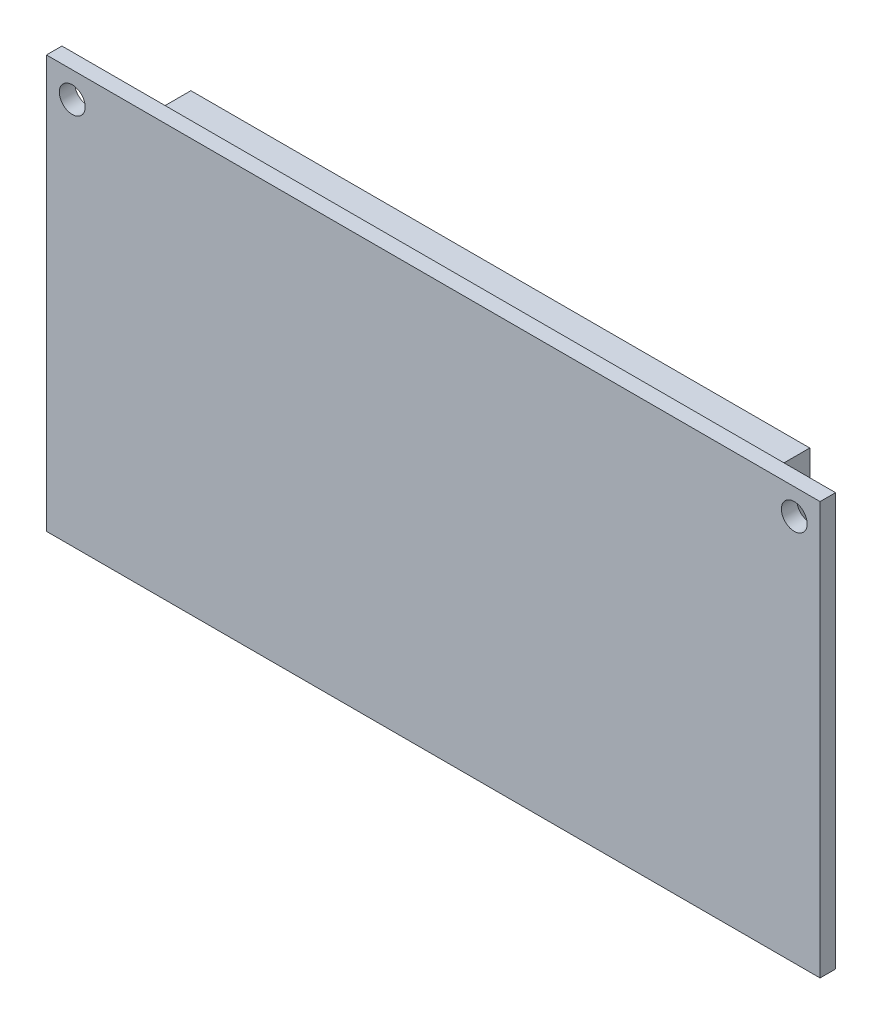
ISO-10303-21;
HEADER;
FILE_DESCRIPTION(('STEP AP214'),'2;1');
FILE_NAME('part.step','',(''),(''),'','','');
FILE_SCHEMA(('AUTOMOTIVE_DESIGN { 1 0 10303 214 1 1 1 1 }'));
ENDSEC;
DATA;
#1=APPLICATION_CONTEXT('core data for automotive mechanical design processes');
#2=APPLICATION_PROTOCOL_DEFINITION('international standard','automotive_design',2000,#1);
#3=PRODUCT_CONTEXT('',#1,'mechanical');
#4=PRODUCT('Part','Part','',(#3));
#5=PRODUCT_RELATED_PRODUCT_CATEGORY('part','',(#4));
#6=PRODUCT_DEFINITION_FORMATION('','',#4);
#7=PRODUCT_DEFINITION_CONTEXT('part definition',#1,'design');
#8=PRODUCT_DEFINITION('design','',#6,#7);
#9=PRODUCT_DEFINITION_SHAPE('','',#8);
#10=(LENGTH_UNIT() NAMED_UNIT(*) SI_UNIT(.MILLI.,.METRE.));
#11=(NAMED_UNIT(*) PLANE_ANGLE_UNIT() SI_UNIT($,.RADIAN.));
#12=(NAMED_UNIT(*) SI_UNIT($,.STERADIAN.) SOLID_ANGLE_UNIT());
#13=UNCERTAINTY_MEASURE_WITH_UNIT(LENGTH_MEASURE(1.E-05),#10,'distance_accuracy_value','');
#14=(GEOMETRIC_REPRESENTATION_CONTEXT(3) GLOBAL_UNCERTAINTY_ASSIGNED_CONTEXT((#13)) GLOBAL_UNIT_ASSIGNED_CONTEXT((#10,
#11,#12)) REPRESENTATION_CONTEXT('',''));
#15=CARTESIAN_POINT('',(0.,0.,0.));
#16=DIRECTION('',(0.,0.,1.));
#17=DIRECTION('',(1.,0.,0.));
#18=AXIS2_PLACEMENT_3D('',#15,#16,#17);
#19=CARTESIAN_POINT('',(0.,0.,0.));
#20=DIRECTION('',(0.,0.,1.));
#21=DIRECTION('',(1.,0.,0.));
#22=AXIS2_PLACEMENT_3D('',#19,#20,#21);
#23=PLANE('',#22);
#24=CARTESIAN_POINT('',(-8.61877519595136,65.2421631901448,0.));
#25=DIRECTION('',(0.,0.,-1.));
#26=DIRECTION('',(-1.,0.,0.));
#27=AXIS2_PLACEMENT_3D('',#24,#25,#26);
#28=CIRCLE('',#27,2.5);
#29=CARTESIAN_POINT('',(-11.1187751959514,65.2421631901448,0.));
#30=VERTEX_POINT('',#29);
#31=EDGE_CURVE('E341',#30,#30,#28,.T.);
#32=ORIENTED_EDGE('',*,*,#31,.F.);
#33=EDGE_LOOP('',(#32));
#34=FACE_BOUND('',#33,.T.);
#35=CARTESIAN_POINT('',(131.381224804049,65.2421631901448,0.));
#36=DIRECTION('',(0.,0.,-1.));
#37=DIRECTION('',(-1.,0.,0.));
#38=AXIS2_PLACEMENT_3D('',#35,#36,#37);
#39=CIRCLE('',#38,2.5);
#40=CARTESIAN_POINT('',(128.881224804049,65.2421631901448,0.));
#41=VERTEX_POINT('',#40);
#42=EDGE_CURVE('E190',#41,#41,#39,.T.);
#43=ORIENTED_EDGE('',*,*,#42,.F.);
#44=EDGE_LOOP('',(#43));
#45=FACE_BOUND('',#44,.T.);
#46=DIRECTION('',(-1.,0.,0.));
#47=VECTOR('',#46,1.);
#48=CARTESIAN_POINT('',(116.381224804049,-2.00783680985524,0.));
#49=LINE('',#48,#47);
#50=CARTESIAN_POINT('',(124.381224804049,-2.00783680985523,0.));
#51=VERTEX_POINT('',#50);
#52=CARTESIAN_POINT('',(116.381224804049,-2.00783680985524,0.));
#53=VERTEX_POINT('',#52);
#54=EDGE_CURVE('E69',#51,#53,#49,.T.);
#55=ORIENTED_EDGE('',*,*,#54,.F.);
#56=DIRECTION('',(0.,-1.,0.));
#57=VECTOR('',#56,1.);
#58=CARTESIAN_POINT('',(124.381224804049,19.2421631901448,0.));
#59=LINE('',#58,#57);
#60=CARTESIAN_POINT('',(124.381224804049,40.4921631901448,0.));
#61=VERTEX_POINT('',#60);
#62=EDGE_CURVE('E218',#61,#51,#59,.T.);
#63=ORIENTED_EDGE('',*,*,#62,.F.);
#64=DIRECTION('',(1.,0.,0.));
#65=VECTOR('',#64,1.);
#66=CARTESIAN_POINT('',(124.381224804049,40.4921631901448,0.));
#67=LINE('',#66,#65);
#68=CARTESIAN_POINT('',(116.381224804049,40.4921631901448,0.));
#69=VERTEX_POINT('',#68);
#70=EDGE_CURVE('E233',#69,#61,#67,.T.);
#71=ORIENTED_EDGE('',*,*,#70,.F.);
#72=DIRECTION('',(0.,-1.,0.));
#73=VECTOR('',#72,1.);
#74=CARTESIAN_POINT('',(116.381224804049,0.,0.));
#75=LINE('',#74,#73);
#76=CARTESIAN_POINT('',(116.381224804049,60.2421631901448,0.));
#77=VERTEX_POINT('',#76);
#78=EDGE_CURVE('E273',#77,#69,#75,.T.);
#79=ORIENTED_EDGE('',*,*,#78,.F.);
#80=DIRECTION('',(-1.,0.,0.));
#81=VECTOR('',#80,1.);
#82=CARTESIAN_POINT('',(0.,60.2421631901448,0.));
#83=LINE('',#82,#81);
#84=CARTESIAN_POINT('',(-3.61877519595136,60.2421631901448,0.));
#85=VERTEX_POINT('',#84);
#86=EDGE_CURVE('E253',#77,#85,#83,.T.);
#87=ORIENTED_EDGE('',*,*,#86,.T.);
#88=DIRECTION('',(0.,-1.,0.));
#89=VECTOR('',#88,1.);
#90=CARTESIAN_POINT('',(-3.61877519595136,0.,0.));
#91=LINE('',#90,#89);
#92=CARTESIAN_POINT('',(-3.61877519595136,-9.75783680985523,0.));
#93=VERTEX_POINT('',#92);
#94=EDGE_CURVE('E259',#85,#93,#91,.T.);
#95=ORIENTED_EDGE('',*,*,#94,.T.);
#96=DIRECTION('',(1.,0.,0.));
#97=VECTOR('',#96,1.);
#98=CARTESIAN_POINT('',(-13.6187751959514,-9.75783680985523,0.));
#99=LINE('',#98,#97);
#100=CARTESIAN_POINT('',(-13.6187751959514,-9.75783680985523,0.));
#101=VERTEX_POINT('',#100);
#102=EDGE_CURVE('E314',#101,#93,#99,.T.);
#103=ORIENTED_EDGE('',*,*,#102,.F.);
#104=DIRECTION('',(0.,-1.,0.));
#105=VECTOR('',#104,1.);
#106=CARTESIAN_POINT('',(-13.6187751959514,70.2421631901448,0.));
#107=LINE('',#106,#105);
#108=CARTESIAN_POINT('',(-13.6187751959514,70.2421631901448,0.));
#109=VERTEX_POINT('',#108);
#110=EDGE_CURVE('E294',#109,#101,#107,.T.);
#111=ORIENTED_EDGE('',*,*,#110,.F.);
#112=DIRECTION('',(-1.,0.,0.));
#113=VECTOR('',#112,1.);
#114=CARTESIAN_POINT('',(-13.6187751959514,70.2421631901448,0.));
#115=LINE('',#114,#113);
#116=CARTESIAN_POINT('',(136.381224804049,70.2421631901448,0.));
#117=VERTEX_POINT('',#116);
#118=EDGE_CURVE('E300',#117,#109,#115,.T.);
#119=ORIENTED_EDGE('',*,*,#118,.F.);
#120=DIRECTION('',(0.,1.,0.));
#121=VECTOR('',#120,1.);
#122=CARTESIAN_POINT('',(136.381224804049,70.2421631901448,0.));
#123=LINE('',#122,#121);
#124=CARTESIAN_POINT('',(136.381224804049,-9.75783680985523,0.));
#125=VERTEX_POINT('',#124);
#126=EDGE_CURVE('E318',#125,#117,#123,.T.);
#127=ORIENTED_EDGE('',*,*,#126,.F.);
#128=CARTESIAN_POINT('',(116.381224804049,-9.75783680985523,0.));
#129=VERTEX_POINT('',#128);
#130=EDGE_CURVE('E313',#129,#125,#99,.T.);
#131=ORIENTED_EDGE('',*,*,#130,.F.);
#132=EDGE_CURVE('E272',#53,#129,#75,.T.);
#133=ORIENTED_EDGE('',*,*,#132,.F.);
#134=EDGE_LOOP('',(#55,#63,#71,#79,#87,#95,#103,#111,#119,#127,#131,#133));
#135=FACE_BOUND('',#134,.T.);
#136=ADVANCED_FACE('F43',(#34,#45,#135),#23,.F.);
#137=CARTESIAN_POINT('',(116.381224804049,0.,-15.));
#138=DIRECTION('',(-1.,0.,0.));
#139=DIRECTION('',(0.,-1.,0.));
#140=AXIS2_PLACEMENT_3D('',#137,#138,#139);
#141=PLANE('',#140);
#142=DIRECTION('',(0.,0.,1.));
#143=VECTOR('',#142,1.);
#144=CARTESIAN_POINT('',(116.381224804049,-2.00783680985524,-5.));
#145=LINE('',#144,#143);
#146=CARTESIAN_POINT('',(116.381224804049,-2.00783680985524,-5.));
#147=VERTEX_POINT('',#146);
#148=EDGE_CURVE('E246',#147,#53,#145,.T.);
#149=ORIENTED_EDGE('',*,*,#148,.T.);
#150=ORIENTED_EDGE('',*,*,#132,.T.);
#151=DIRECTION('',(0.,0.,1.));
#152=VECTOR('',#151,1.);
#153=CARTESIAN_POINT('',(116.381224804049,-9.75783680985523,-15.));
#154=LINE('',#153,#152);
#155=CARTESIAN_POINT('',(116.381224804049,-9.75783680985523,-15.));
#156=VERTEX_POINT('',#155);
#157=EDGE_CURVE('E286',#156,#129,#154,.T.);
#158=ORIENTED_EDGE('',*,*,#157,.F.);
#159=DIRECTION('',(0.,-1.,0.));
#160=VECTOR('',#159,1.);
#161=CARTESIAN_POINT('',(116.381224804049,0.,-15.));
#162=LINE('',#161,#160);
#163=CARTESIAN_POINT('',(116.381224804049,60.2421631901448,-15.));
#164=VERTEX_POINT('',#163);
#165=EDGE_CURVE('E258',#164,#156,#162,.T.);
#166=ORIENTED_EDGE('',*,*,#165,.F.);
#167=DIRECTION('',(0.,0.,1.));
#168=VECTOR('',#167,1.);
#169=CARTESIAN_POINT('',(116.381224804049,60.2421631901448,-15.));
#170=LINE('',#169,#168);
#171=EDGE_CURVE('E290',#164,#77,#170,.T.);
#172=ORIENTED_EDGE('',*,*,#171,.T.);
#173=ORIENTED_EDGE('',*,*,#78,.T.);
#174=DIRECTION('',(0.,0.,1.));
#175=VECTOR('',#174,1.);
#176=CARTESIAN_POINT('',(116.381224804049,40.4921631901448,-5.));
#177=LINE('',#176,#175);
#178=CARTESIAN_POINT('',(116.381224804049,40.4921631901448,-5.));
#179=VERTEX_POINT('',#178);
#180=EDGE_CURVE('E242',#179,#69,#177,.T.);
#181=ORIENTED_EDGE('',*,*,#180,.F.);
#182=DIRECTION('',(0.,1.,0.));
#183=VECTOR('',#182,1.);
#184=CARTESIAN_POINT('',(116.381224804049,40.4921631901448,-5.));
#185=LINE('',#184,#183);
#186=EDGE_CURVE('E222',#147,#179,#185,.T.);
#187=ORIENTED_EDGE('',*,*,#186,.F.);
#188=EDGE_LOOP('',(#149,#150,#158,#166,#172,#173,#181,#187));
#189=FACE_BOUND('',#188,.T.);
#190=ADVANCED_FACE('F352',(#189),#141,.F.);
#191=CARTESIAN_POINT('',(-13.6187751959514,70.2421631901448,3.));
#192=DIRECTION('',(1.,0.,0.));
#193=DIRECTION('',(0.,1.,0.));
#194=AXIS2_PLACEMENT_3D('',#191,#192,#193);
#195=PLANE('',#194);
#196=ORIENTED_EDGE('',*,*,#110,.T.);
#197=DIRECTION('',(0.,0.,-1.));
#198=VECTOR('',#197,1.);
#199=CARTESIAN_POINT('',(-13.6187751959514,-9.75783680985523,3.));
#200=LINE('',#199,#198);
#201=CARTESIAN_POINT('',(-13.6187751959514,-9.75783680985523,3.));
#202=VERTEX_POINT('',#201);
#203=EDGE_CURVE('E11',#202,#101,#200,.T.);
#204=ORIENTED_EDGE('',*,*,#203,.F.);
#205=DIRECTION('',(0.,-1.,0.));
#206=VECTOR('',#205,1.);
#207=CARTESIAN_POINT('',(-13.6187751959514,70.2421631901448,3.));
#208=LINE('',#207,#206);
#209=CARTESIAN_POINT('',(-13.6187751959514,70.2421631901448,3.));
#210=VERTEX_POINT('',#209);
#211=EDGE_CURVE('E295',#210,#202,#208,.T.);
#212=ORIENTED_EDGE('',*,*,#211,.F.);
#213=DIRECTION('',(0.,0.,-1.));
#214=VECTOR('',#213,1.);
#215=CARTESIAN_POINT('',(-13.6187751959514,70.2421631901448,3.));
#216=LINE('',#215,#214);
#217=EDGE_CURVE('E309',#210,#109,#216,.T.);
#218=ORIENTED_EDGE('',*,*,#217,.T.);
#219=EDGE_LOOP('',(#196,#204,#212,#218));
#220=FACE_BOUND('',#219,.T.);
#221=ADVANCED_FACE('F45',(#220),#195,.F.);
#222=CARTESIAN_POINT('',(-13.6187751959514,-9.75783680985523,3.));
#223=DIRECTION('',(0.,1.,0.));
#224=DIRECTION('',(0.,0.,1.));
#225=AXIS2_PLACEMENT_3D('',#222,#223,#224);
#226=PLANE('',#225);
#227=ORIENTED_EDGE('',*,*,#102,.T.);
#228=DIRECTION('',(0.,0.,1.));
#229=VECTOR('',#228,1.);
#230=CARTESIAN_POINT('',(-3.61877519595136,-9.75783680985523,-15.));
#231=LINE('',#230,#229);
#232=CARTESIAN_POINT('',(-3.61877519595136,-9.75783680985523,-15.));
#233=VERTEX_POINT('',#232);
#234=EDGE_CURVE('E282',#233,#93,#231,.T.);
#235=ORIENTED_EDGE('',*,*,#234,.F.);
#236=DIRECTION('',(-1.,0.,0.));
#237=VECTOR('',#236,1.);
#238=CARTESIAN_POINT('',(0.,-9.75783680985523,-15.));
#239=LINE('',#238,#237);
#240=EDGE_CURVE('E262',#156,#233,#239,.T.);
#241=ORIENTED_EDGE('',*,*,#240,.F.);
#242=ORIENTED_EDGE('',*,*,#157,.T.);
#243=ORIENTED_EDGE('',*,*,#130,.T.);
#244=DIRECTION('',(0.,0.,-1.));
#245=VECTOR('',#244,1.);
#246=CARTESIAN_POINT('',(136.381224804049,-9.75783680985523,3.));
#247=LINE('',#246,#245);
#248=CARTESIAN_POINT('',(136.381224804049,-9.75783680985523,3.));
#249=VERTEX_POINT('',#248);
#250=EDGE_CURVE('E53',#249,#125,#247,.T.);
#251=ORIENTED_EDGE('',*,*,#250,.F.);
#252=DIRECTION('',(1.,0.,0.));
#253=VECTOR('',#252,1.);
#254=CARTESIAN_POINT('',(-13.6187751959514,-9.75783680985523,3.));
#255=LINE('',#254,#253);
#256=EDGE_CURVE('E299',#202,#249,#255,.T.);
#257=ORIENTED_EDGE('',*,*,#256,.F.);
#258=ORIENTED_EDGE('',*,*,#203,.T.);
#259=EDGE_LOOP('',(#227,#235,#241,#242,#243,#251,#257,#258));
#260=FACE_BOUND('',#259,.T.);
#261=ADVANCED_FACE('F369',(#260),#226,.F.);
#262=CARTESIAN_POINT('',(136.381224804049,70.2421631901448,3.));
#263=DIRECTION('',(-1.,0.,0.));
#264=DIRECTION('',(0.,0.,1.));
#265=AXIS2_PLACEMENT_3D('',#262,#263,#264);
#266=PLANE('',#265);
#267=ORIENTED_EDGE('',*,*,#126,.T.);
#268=DIRECTION('',(0.,0.,-1.));
#269=VECTOR('',#268,1.);
#270=CARTESIAN_POINT('',(136.381224804049,70.2421631901448,3.));
#271=LINE('',#270,#269);
#272=CARTESIAN_POINT('',(136.381224804049,70.2421631901448,3.));
#273=VERTEX_POINT('',#272);
#274=EDGE_CURVE('E326',#273,#117,#271,.T.);
#275=ORIENTED_EDGE('',*,*,#274,.F.);
#276=DIRECTION('',(0.,1.,0.));
#277=VECTOR('',#276,1.);
#278=CARTESIAN_POINT('',(136.381224804049,70.2421631901448,3.));
#279=LINE('',#278,#277);
#280=EDGE_CURVE('E303',#249,#273,#279,.T.);
#281=ORIENTED_EDGE('',*,*,#280,.F.);
#282=ORIENTED_EDGE('',*,*,#250,.T.);
#283=EDGE_LOOP('',(#267,#275,#281,#282));
#284=FACE_BOUND('',#283,.T.);
#285=ADVANCED_FACE('F366',(#284),#266,.F.);
#286=CARTESIAN_POINT('',(-13.6187751959514,70.2421631901448,3.));
#287=DIRECTION('',(0.,-1.,0.));
#288=DIRECTION('',(0.,0.,-1.));
#289=AXIS2_PLACEMENT_3D('',#286,#287,#288);
#290=PLANE('',#289);
#291=ORIENTED_EDGE('',*,*,#118,.T.);
#292=ORIENTED_EDGE('',*,*,#217,.F.);
#293=DIRECTION('',(-1.,0.,0.));
#294=VECTOR('',#293,1.);
#295=CARTESIAN_POINT('',(-13.6187751959514,70.2421631901448,3.));
#296=LINE('',#295,#294);
#297=EDGE_CURVE('E306',#273,#210,#296,.T.);
#298=ORIENTED_EDGE('',*,*,#297,.F.);
#299=ORIENTED_EDGE('',*,*,#274,.T.);
#300=EDGE_LOOP('',(#291,#292,#298,#299));
#301=FACE_BOUND('',#300,.T.);
#302=ADVANCED_FACE('F363',(#301),#290,.F.);
#303=CARTESIAN_POINT('',(0.,0.,3.));
#304=DIRECTION('',(0.,0.,1.));
#305=DIRECTION('',(1.,0.,0.));
#306=AXIS2_PLACEMENT_3D('',#303,#304,#305);
#307=PLANE('',#306);
#308=CARTESIAN_POINT('',(-8.61877519595136,65.2421631901448,3.));
#309=DIRECTION('',(0.,0.,1.));
#310=DIRECTION('',(1.,0.,0.));
#311=AXIS2_PLACEMENT_3D('',#308,#309,#310);
#312=CIRCLE('',#311,2.5);
#313=CARTESIAN_POINT('',(-6.11877519595136,65.2421631901448,3.));
#314=VERTEX_POINT('',#313);
#315=EDGE_CURVE('E47',#314,#314,#312,.T.);
#316=ORIENTED_EDGE('',*,*,#315,.F.);
#317=EDGE_LOOP('',(#316));
#318=FACE_BOUND('',#317,.T.);
#319=CARTESIAN_POINT('',(131.381224804049,65.2421631901448,3.));
#320=DIRECTION('',(0.,0.,1.));
#321=DIRECTION('',(1.,0.,0.));
#322=AXIS2_PLACEMENT_3D('',#319,#320,#321);
#323=CIRCLE('',#322,2.5);
#324=CARTESIAN_POINT('',(133.881224804049,65.2421631901448,3.));
#325=VERTEX_POINT('',#324);
#326=EDGE_CURVE('E332',#325,#325,#323,.T.);
#327=ORIENTED_EDGE('',*,*,#326,.F.);
#328=EDGE_LOOP('',(#327));
#329=FACE_BOUND('',#328,.T.);
#330=ORIENTED_EDGE('',*,*,#211,.T.);
#331=ORIENTED_EDGE('',*,*,#256,.T.);
#332=ORIENTED_EDGE('',*,*,#280,.T.);
#333=ORIENTED_EDGE('',*,*,#297,.T.);
#334=EDGE_LOOP('',(#330,#331,#332,#333));
#335=FACE_BOUND('',#334,.T.);
#336=ADVANCED_FACE('F361',(#318,#329,#335),#307,.T.);
#337=CARTESIAN_POINT('',(0.,60.2421631901448,-15.));
#338=DIRECTION('',(0.,1.,0.));
#339=DIRECTION('',(0.,0.,1.));
#340=AXIS2_PLACEMENT_3D('',#337,#338,#339);
#341=PLANE('',#340);
#342=ORIENTED_EDGE('',*,*,#86,.F.);
#343=ORIENTED_EDGE('',*,*,#171,.F.);
#344=DIRECTION('',(-1.,0.,0.));
#345=VECTOR('',#344,1.);
#346=CARTESIAN_POINT('',(0.,60.2421631901448,-15.));
#347=LINE('',#346,#345);
#348=CARTESIAN_POINT('',(-3.61877519595136,60.2421631901448,-15.));
#349=VERTEX_POINT('',#348);
#350=EDGE_CURVE('E254',#164,#349,#347,.T.);
#351=ORIENTED_EDGE('',*,*,#350,.T.);
#352=DIRECTION('',(0.,0.,1.));
#353=VECTOR('',#352,1.);
#354=CARTESIAN_POINT('',(-3.61877519595136,60.2421631901448,-15.));
#355=LINE('',#354,#353);
#356=EDGE_CURVE('E269',#349,#85,#355,.T.);
#357=ORIENTED_EDGE('',*,*,#356,.T.);
#358=EDGE_LOOP('',(#342,#343,#351,#357));
#359=FACE_BOUND('',#358,.T.);
#360=ADVANCED_FACE('F404',(#359),#341,.T.);
#361=CARTESIAN_POINT('',(-3.61877519595136,0.,-15.));
#362=DIRECTION('',(-1.,0.,0.));
#363=DIRECTION('',(0.,0.,1.));
#364=AXIS2_PLACEMENT_3D('',#361,#362,#363);
#365=PLANE('',#364);
#366=ORIENTED_EDGE('',*,*,#94,.F.);
#367=ORIENTED_EDGE('',*,*,#356,.F.);
#368=DIRECTION('',(0.,-1.,0.));
#369=VECTOR('',#368,1.);
#370=CARTESIAN_POINT('',(-3.61877519595136,0.,-15.));
#371=LINE('',#370,#369);
#372=EDGE_CURVE('E265',#349,#233,#371,.T.);
#373=ORIENTED_EDGE('',*,*,#372,.T.);
#374=ORIENTED_EDGE('',*,*,#234,.T.);
#375=EDGE_LOOP('',(#366,#367,#373,#374));
#376=FACE_BOUND('',#375,.T.);
#377=ADVANCED_FACE('F383',(#376),#365,.T.);
#378=CARTESIAN_POINT('',(0.,0.,-15.));
#379=DIRECTION('',(0.,0.,-1.));
#380=DIRECTION('',(-1.,0.,0.));
#381=AXIS2_PLACEMENT_3D('',#378,#379,#380);
#382=PLANE('',#381);
#383=DIRECTION('',(0.,-1.,0.));
#384=VECTOR('',#383,1.);
#385=CARTESIAN_POINT('',(111.381224804049,55.2421631901448,-15.));
#386=LINE('',#385,#384);
#387=CARTESIAN_POINT('',(111.381224804049,55.2421631901448,-15.));
#388=VERTEX_POINT('',#387);
#389=CARTESIAN_POINT('',(111.381224804049,-4.75783680985523,-15.));
#390=VERTEX_POINT('',#389);
#391=EDGE_CURVE('E61',#388,#390,#386,.T.);
#392=ORIENTED_EDGE('',*,*,#391,.F.);
#393=DIRECTION('',(1.,0.,0.));
#394=VECTOR('',#393,1.);
#395=CARTESIAN_POINT('',(111.381224804049,55.2421631901448,-15.));
#396=LINE('',#395,#394);
#397=CARTESIAN_POINT('',(1.38122480404865,55.2421631901448,-15.));
#398=VERTEX_POINT('',#397);
#399=EDGE_CURVE('E183',#398,#388,#396,.T.);
#400=ORIENTED_EDGE('',*,*,#399,.F.);
#401=DIRECTION('',(0.,1.,0.));
#402=VECTOR('',#401,1.);
#403=CARTESIAN_POINT('',(1.38122480404865,55.2421631901448,-15.));
#404=LINE('',#403,#402);
#405=CARTESIAN_POINT('',(1.38122480404863,-4.75783680985523,-15.));
#406=VERTEX_POINT('',#405);
#407=EDGE_CURVE('E187',#406,#398,#404,.T.);
#408=ORIENTED_EDGE('',*,*,#407,.F.);
#409=DIRECTION('',(-1.,0.,0.));
#410=VECTOR('',#409,1.);
#411=CARTESIAN_POINT('',(111.381224804049,-4.75783680985523,-15.));
#412=LINE('',#411,#410);
#413=EDGE_CURVE('E199',#390,#406,#412,.T.);
#414=ORIENTED_EDGE('',*,*,#413,.F.);
#415=EDGE_LOOP('',(#392,#400,#408,#414));
#416=FACE_BOUND('',#415,.T.);
#417=ORIENTED_EDGE('',*,*,#350,.F.);
#418=ORIENTED_EDGE('',*,*,#165,.T.);
#419=ORIENTED_EDGE('',*,*,#240,.T.);
#420=ORIENTED_EDGE('',*,*,#372,.F.);
#421=EDGE_LOOP('',(#417,#418,#419,#420));
#422=FACE_BOUND('',#421,.T.);
#423=ADVANCED_FACE('F387',(#416,#422),#382,.T.);
#424=CARTESIAN_POINT('',(116.381224804049,-2.00783680985524,-5.));
#425=DIRECTION('',(0.,1.,0.));
#426=DIRECTION('',(-1.,0.,0.));
#427=AXIS2_PLACEMENT_3D('',#424,#425,#426);
#428=PLANE('',#427);
#429=ORIENTED_EDGE('',*,*,#54,.T.);
#430=ORIENTED_EDGE('',*,*,#148,.F.);
#431=DIRECTION('',(-1.,0.,0.));
#432=VECTOR('',#431,1.);
#433=CARTESIAN_POINT('',(116.381224804049,-2.00783680985524,-5.));
#434=LINE('',#433,#432);
#435=CARTESIAN_POINT('',(124.381224804049,-2.00783680985523,-5.));
#436=VERTEX_POINT('',#435);
#437=EDGE_CURVE('E217',#436,#147,#434,.T.);
#438=ORIENTED_EDGE('',*,*,#437,.F.);
#439=DIRECTION('',(0.,0.,1.));
#440=VECTOR('',#439,1.);
#441=CARTESIAN_POINT('',(124.381224804049,-2.00783680985523,-5.));
#442=LINE('',#441,#440);
#443=EDGE_CURVE('E249',#436,#51,#442,.T.);
#444=ORIENTED_EDGE('',*,*,#443,.T.);
#445=EDGE_LOOP('',(#429,#430,#438,#444));
#446=FACE_BOUND('',#445,.T.);
#447=ADVANCED_FACE('F446',(#446),#428,.F.);
#448=CARTESIAN_POINT('',(124.381224804049,40.4921631901448,-5.));
#449=DIRECTION('',(0.,-1.,0.));
#450=DIRECTION('',(0.,0.,-1.));
#451=AXIS2_PLACEMENT_3D('',#448,#449,#450);
#452=PLANE('',#451);
#453=ORIENTED_EDGE('',*,*,#70,.T.);
#454=DIRECTION('',(0.,0.,1.));
#455=VECTOR('',#454,1.);
#456=CARTESIAN_POINT('',(124.381224804049,40.4921631901448,-5.));
#457=LINE('',#456,#455);
#458=CARTESIAN_POINT('',(124.381224804049,40.4921631901448,-5.));
#459=VERTEX_POINT('',#458);
#460=EDGE_CURVE('E230',#459,#61,#457,.T.);
#461=ORIENTED_EDGE('',*,*,#460,.F.);
#462=DIRECTION('',(1.,0.,0.));
#463=VECTOR('',#462,1.);
#464=CARTESIAN_POINT('',(124.381224804049,40.4921631901448,-5.));
#465=LINE('',#464,#463);
#466=EDGE_CURVE('E226',#179,#459,#465,.T.);
#467=ORIENTED_EDGE('',*,*,#466,.F.);
#468=ORIENTED_EDGE('',*,*,#180,.T.);
#469=EDGE_LOOP('',(#453,#461,#467,#468));
#470=FACE_BOUND('',#469,.T.);
#471=ADVANCED_FACE('F442',(#470),#452,.F.);
#472=CARTESIAN_POINT('',(124.381224804049,19.2421631901448,-5.));
#473=DIRECTION('',(-1.,0.,0.));
#474=DIRECTION('',(0.,0.,1.));
#475=AXIS2_PLACEMENT_3D('',#472,#473,#474);
#476=PLANE('',#475);
#477=ORIENTED_EDGE('',*,*,#62,.T.);
#478=ORIENTED_EDGE('',*,*,#443,.F.);
#479=DIRECTION('',(0.,-1.,0.));
#480=VECTOR('',#479,1.);
#481=CARTESIAN_POINT('',(124.381224804049,19.2421631901448,-5.));
#482=LINE('',#481,#480);
#483=EDGE_CURVE('E213',#459,#436,#482,.T.);
#484=ORIENTED_EDGE('',*,*,#483,.F.);
#485=ORIENTED_EDGE('',*,*,#460,.T.);
#486=EDGE_LOOP('',(#477,#478,#484,#485));
#487=FACE_BOUND('',#486,.T.);
#488=ADVANCED_FACE('F438',(#487),#476,.F.);
#489=CARTESIAN_POINT('',(0.,0.,-5.));
#490=DIRECTION('',(0.,0.,1.));
#491=DIRECTION('',(1.,0.,0.));
#492=AXIS2_PLACEMENT_3D('',#489,#490,#491);
#493=PLANE('',#492);
#494=ORIENTED_EDGE('',*,*,#483,.T.);
#495=ORIENTED_EDGE('',*,*,#437,.T.);
#496=ORIENTED_EDGE('',*,*,#186,.T.);
#497=ORIENTED_EDGE('',*,*,#466,.T.);
#498=EDGE_LOOP('',(#494,#495,#496,#497));
#499=FACE_BOUND('',#498,.T.);
#500=ADVANCED_FACE('F435',(#499),#493,.F.);
#501=CARTESIAN_POINT('',(111.381224804049,55.2421631901448,-10.));
#502=DIRECTION('',(1.,0.,0.));
#503=DIRECTION('',(0.,1.,0.));
#504=AXIS2_PLACEMENT_3D('',#501,#502,#503);
#505=PLANE('',#504);
#506=ORIENTED_EDGE('',*,*,#391,.T.);
#507=DIRECTION('',(0.,0.,-1.));
#508=VECTOR('',#507,1.);
#509=CARTESIAN_POINT('',(111.381224804049,-4.75783680985523,-10.));
#510=LINE('',#509,#508);
#511=CARTESIAN_POINT('',(111.381224804049,-4.75783680985523,-10.));
#512=VERTEX_POINT('',#511);
#513=EDGE_CURVE('E158',#512,#390,#510,.T.);
#514=ORIENTED_EDGE('',*,*,#513,.F.);
#515=DIRECTION('',(0.,-1.,0.));
#516=VECTOR('',#515,1.);
#517=CARTESIAN_POINT('',(111.381224804049,55.2421631901448,-10.));
#518=LINE('',#517,#516);
#519=CARTESIAN_POINT('',(111.381224804049,55.2421631901448,-10.));
#520=VERTEX_POINT('',#519);
#521=EDGE_CURVE('E162',#520,#512,#518,.T.);
#522=ORIENTED_EDGE('',*,*,#521,.F.);
#523=DIRECTION('',(0.,0.,-1.));
#524=VECTOR('',#523,1.);
#525=CARTESIAN_POINT('',(111.381224804049,55.2421631901448,-10.));
#526=LINE('',#525,#524);
#527=EDGE_CURVE('E205',#520,#388,#526,.T.);
#528=ORIENTED_EDGE('',*,*,#527,.T.);
#529=EDGE_LOOP('',(#506,#514,#522,#528));
#530=FACE_BOUND('',#529,.T.);
#531=ADVANCED_FACE('F160',(#530),#505,.F.);
#532=CARTESIAN_POINT('',(111.381224804049,55.2421631901448,-10.));
#533=DIRECTION('',(0.,1.,0.));
#534=DIRECTION('',(0.,0.,1.));
#535=AXIS2_PLACEMENT_3D('',#532,#533,#534);
#536=PLANE('',#535);
#537=ORIENTED_EDGE('',*,*,#399,.T.);
#538=ORIENTED_EDGE('',*,*,#527,.F.);
#539=DIRECTION('',(1.,0.,0.));
#540=VECTOR('',#539,1.);
#541=CARTESIAN_POINT('',(111.381224804049,55.2421631901448,-10.));
#542=LINE('',#541,#540);
#543=CARTESIAN_POINT('',(1.38122480404865,55.2421631901448,-10.));
#544=VERTEX_POINT('',#543);
#545=EDGE_CURVE('E169',#544,#520,#542,.T.);
#546=ORIENTED_EDGE('',*,*,#545,.F.);
#547=DIRECTION('',(0.,0.,-1.));
#548=VECTOR('',#547,1.);
#549=CARTESIAN_POINT('',(1.38122480404865,55.2421631901448,-10.));
#550=LINE('',#549,#548);
#551=EDGE_CURVE('E208',#544,#398,#550,.T.);
#552=ORIENTED_EDGE('',*,*,#551,.T.);
#553=EDGE_LOOP('',(#537,#538,#546,#552));
#554=FACE_BOUND('',#553,.T.);
#555=ADVANCED_FACE('F423',(#554),#536,.F.);
#556=CARTESIAN_POINT('',(1.38122480404865,55.2421631901448,-10.));
#557=DIRECTION('',(-1.,0.,0.));
#558=DIRECTION('',(0.,-1.,0.));
#559=AXIS2_PLACEMENT_3D('',#556,#557,#558);
#560=PLANE('',#559);
#561=ORIENTED_EDGE('',*,*,#407,.T.);
#562=ORIENTED_EDGE('',*,*,#551,.F.);
#563=DIRECTION('',(0.,1.,0.));
#564=VECTOR('',#563,1.);
#565=CARTESIAN_POINT('',(1.38122480404865,55.2421631901448,-10.));
#566=LINE('',#565,#564);
#567=CARTESIAN_POINT('',(1.38122480404863,-4.75783680985523,-10.));
#568=VERTEX_POINT('',#567);
#569=EDGE_CURVE('E178',#568,#544,#566,.T.);
#570=ORIENTED_EDGE('',*,*,#569,.F.);
#571=DIRECTION('',(0.,0.,-1.));
#572=VECTOR('',#571,1.);
#573=CARTESIAN_POINT('',(1.38122480404863,-4.75783680985523,-10.));
#574=LINE('',#573,#572);
#575=EDGE_CURVE('E168',#568,#406,#574,.T.);
#576=ORIENTED_EDGE('',*,*,#575,.T.);
#577=EDGE_LOOP('',(#561,#562,#570,#576));
#578=FACE_BOUND('',#577,.T.);
#579=ADVANCED_FACE('F426',(#578),#560,.F.);
#580=CARTESIAN_POINT('',(111.381224804049,-4.75783680985523,-10.));
#581=DIRECTION('',(0.,-1.,0.));
#582=DIRECTION('',(0.,0.,-1.));
#583=AXIS2_PLACEMENT_3D('',#580,#581,#582);
#584=PLANE('',#583);
#585=ORIENTED_EDGE('',*,*,#413,.T.);
#586=ORIENTED_EDGE('',*,*,#575,.F.);
#587=DIRECTION('',(-1.,0.,0.));
#588=VECTOR('',#587,1.);
#589=CARTESIAN_POINT('',(111.381224804049,-4.75783680985523,-10.));
#590=LINE('',#589,#588);
#591=EDGE_CURVE('E172',#512,#568,#590,.T.);
#592=ORIENTED_EDGE('',*,*,#591,.F.);
#593=ORIENTED_EDGE('',*,*,#513,.T.);
#594=EDGE_LOOP('',(#585,#586,#592,#593));
#595=FACE_BOUND('',#594,.T.);
#596=ADVANCED_FACE('F173',(#595),#584,.F.);
#597=CARTESIAN_POINT('',(0.,0.,-10.));
#598=DIRECTION('',(0.,0.,-1.));
#599=DIRECTION('',(-1.,0.,0.));
#600=AXIS2_PLACEMENT_3D('',#597,#598,#599);
#601=PLANE('',#600);
#602=ORIENTED_EDGE('',*,*,#521,.T.);
#603=ORIENTED_EDGE('',*,*,#591,.T.);
#604=ORIENTED_EDGE('',*,*,#569,.T.);
#605=ORIENTED_EDGE('',*,*,#545,.T.);
#606=EDGE_LOOP('',(#602,#603,#604,#605));
#607=FACE_BOUND('',#606,.T.);
#608=ADVANCED_FACE('F180',(#607),#601,.T.);
#609=CARTESIAN_POINT('',(131.381224804049,65.2421631901448,5.));
#610=DIRECTION('',(0.,0.,-1.));
#611=DIRECTION('',(-1.,0.,0.));
#612=AXIS2_PLACEMENT_3D('',#609,#610,#611);
#613=CYLINDRICAL_SURFACE('',#612,2.5);
#614=ORIENTED_EDGE('',*,*,#326,.T.);
#615=EDGE_LOOP('',(#614));
#616=FACE_BOUND('',#615,.T.);
#617=ORIENTED_EDGE('',*,*,#42,.T.);
#618=EDGE_LOOP('',(#617));
#619=FACE_BOUND('',#618,.T.);
#620=ADVANCED_FACE('F414',(#616,#619),#613,.F.);
#621=CARTESIAN_POINT('',(-8.61877519595136,65.2421631901448,5.));
#622=DIRECTION('',(0.,0.,-1.));
#623=DIRECTION('',(-1.,0.,0.));
#624=AXIS2_PLACEMENT_3D('',#621,#622,#623);
#625=CYLINDRICAL_SURFACE('',#624,2.5);
#626=ORIENTED_EDGE('',*,*,#315,.T.);
#627=EDGE_LOOP('',(#626));
#628=FACE_BOUND('',#627,.T.);
#629=ORIENTED_EDGE('',*,*,#31,.T.);
#630=EDGE_LOOP('',(#629));
#631=FACE_BOUND('',#630,.T.);
#632=ADVANCED_FACE('F348',(#628,#631),#625,.F.);
#633=CLOSED_SHELL('',(#136,#190,#221,#261,#285,#302,#336,#360,#377,#423,#447,#471,#488,#500,
#531,#555,#579,#596,#608,#620,#632));
#634=MANIFOLD_SOLID_BREP('B2',#633);
#635=ADVANCED_BREP_SHAPE_REPRESENTATION('',(#18,#634),#14);
#636=SHAPE_DEFINITION_REPRESENTATION(#9,#635);
ENDSEC;
END-ISO-10303-21;
